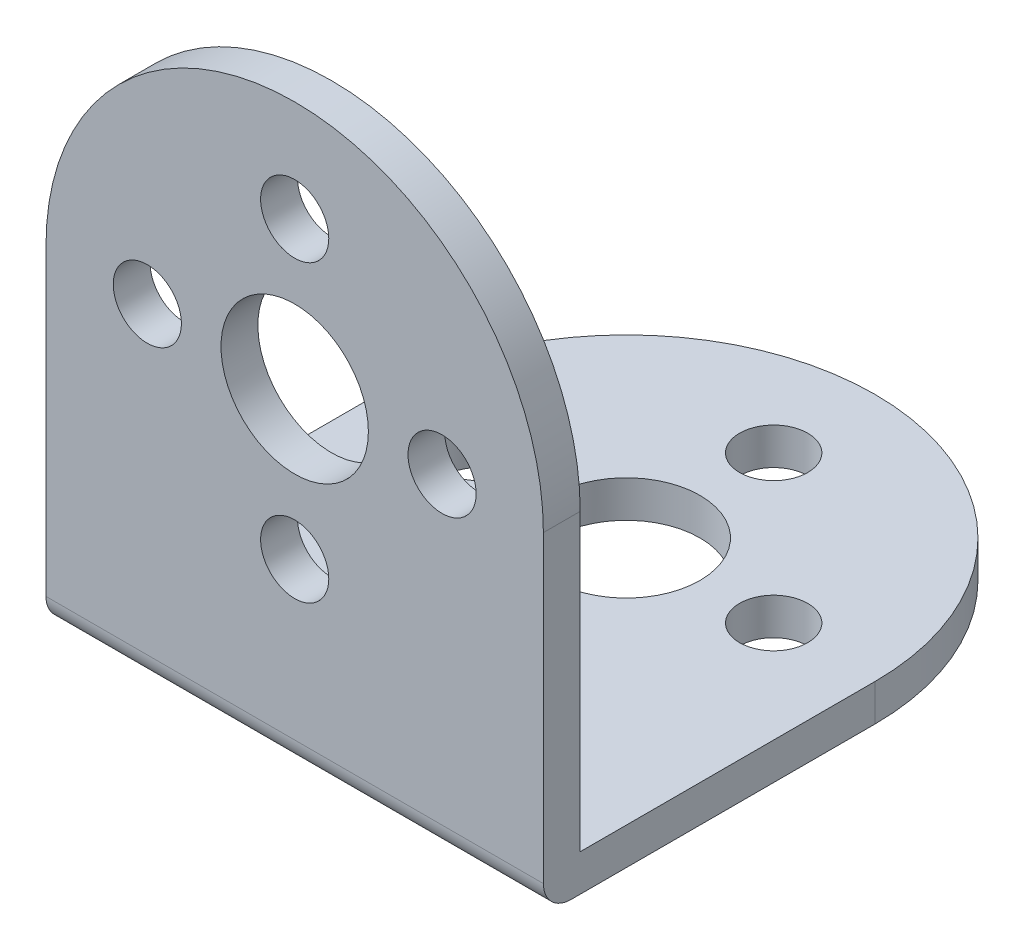
ISO-10303-21;
HEADER;
FILE_DESCRIPTION(('STEP AP214'),'2;1');
FILE_NAME('part.step','',(''),(''),'','','');
FILE_SCHEMA(('AUTOMOTIVE_DESIGN { 1 0 10303 214 1 1 1 1 }'));
ENDSEC;
DATA;
#1=APPLICATION_CONTEXT('core data for automotive mechanical design processes');
#2=APPLICATION_PROTOCOL_DEFINITION('international standard','automotive_design',2000,#1);
#3=PRODUCT_CONTEXT('',#1,'mechanical');
#4=PRODUCT('Part','Part','',(#3));
#5=PRODUCT_RELATED_PRODUCT_CATEGORY('part','',(#4));
#6=PRODUCT_DEFINITION_FORMATION('','',#4);
#7=PRODUCT_DEFINITION_CONTEXT('part definition',#1,'design');
#8=PRODUCT_DEFINITION('design','',#6,#7);
#9=PRODUCT_DEFINITION_SHAPE('','',#8);
#10=(LENGTH_UNIT() NAMED_UNIT(*) SI_UNIT(.MILLI.,.METRE.));
#11=(NAMED_UNIT(*) PLANE_ANGLE_UNIT() SI_UNIT($,.RADIAN.));
#12=(NAMED_UNIT(*) SI_UNIT($,.STERADIAN.) SOLID_ANGLE_UNIT());
#13=UNCERTAINTY_MEASURE_WITH_UNIT(LENGTH_MEASURE(1.E-05),#10,'distance_accuracy_value','');
#14=(GEOMETRIC_REPRESENTATION_CONTEXT(3) GLOBAL_UNCERTAINTY_ASSIGNED_CONTEXT((#13)) GLOBAL_UNIT_ASSIGNED_CONTEXT((#10,
#11,#12)) REPRESENTATION_CONTEXT('',''));
#15=CARTESIAN_POINT('',(0.,0.,0.));
#16=DIRECTION('',(0.,0.,1.));
#17=DIRECTION('',(1.,0.,0.));
#18=AXIS2_PLACEMENT_3D('',#15,#16,#17);
#19=CARTESIAN_POINT('',(0.,2.,-18.));
#20=DIRECTION('',(0.,1.,0.));
#21=DIRECTION('',(0.,0.,1.));
#22=AXIS2_PLACEMENT_3D('',#19,#20,#21);
#23=CYLINDRICAL_SURFACE('',#22,13.5);
#24=DIRECTION('',(0.,-1.,0.));
#25=VECTOR('',#24,1.);
#26=CARTESIAN_POINT('',(-13.5,2.,-18.));
#27=LINE('',#26,#25);
#28=CARTESIAN_POINT('',(-13.5,2.,-18.));
#29=VERTEX_POINT('',#28);
#30=CARTESIAN_POINT('',(-13.5,0.,-18.));
#31=VERTEX_POINT('',#30);
#32=EDGE_CURVE('E139',#29,#31,#27,.T.);
#33=ORIENTED_EDGE('',*,*,#32,.F.);
#34=CARTESIAN_POINT('',(0.,2.,-18.));
#35=DIRECTION('',(0.,1.,0.));
#36=DIRECTION('',(0.,0.,1.));
#37=AXIS2_PLACEMENT_3D('',#34,#35,#36);
#38=CIRCLE('',#37,13.5);
#39=CARTESIAN_POINT('',(13.5,2.,-18.));
#40=VERTEX_POINT('',#39);
#41=EDGE_CURVE('E100',#40,#29,#38,.T.);
#42=ORIENTED_EDGE('',*,*,#41,.F.);
#43=DIRECTION('',(0.,1.,0.));
#44=VECTOR('',#43,1.);
#45=CARTESIAN_POINT('',(13.5,0.,-18.));
#46=LINE('',#45,#44);
#47=CARTESIAN_POINT('',(13.5,0.,-18.));
#48=VERTEX_POINT('',#47);
#49=EDGE_CURVE('E141',#48,#40,#46,.T.);
#50=ORIENTED_EDGE('',*,*,#49,.F.);
#51=CARTESIAN_POINT('',(0.,0.,-18.));
#52=DIRECTION('',(0.,-1.,0.));
#53=DIRECTION('',(0.,0.,-1.));
#54=AXIS2_PLACEMENT_3D('',#51,#52,#53);
#55=CIRCLE('',#54,13.5);
#56=EDGE_CURVE('E145',#31,#48,#55,.T.);
#57=ORIENTED_EDGE('',*,*,#56,.F.);
#58=EDGE_LOOP('',(#33,#42,#50,#57));
#59=FACE_BOUND('',#58,.T.);
#60=ADVANCED_FACE('F37',(#59),#23,.T.);
#61=CARTESIAN_POINT('',(0.,18.,-2.));
#62=DIRECTION('',(0.,0.,1.));
#63=DIRECTION('',(1.,0.,0.));
#64=AXIS2_PLACEMENT_3D('',#61,#62,#63);
#65=CYLINDRICAL_SURFACE('',#64,13.5);
#66=DIRECTION('',(0.,0.,1.));
#67=VECTOR('',#66,1.);
#68=CARTESIAN_POINT('',(13.5,18.,0.));
#69=LINE('',#68,#67);
#70=CARTESIAN_POINT('',(13.5,18.,-2.));
#71=VERTEX_POINT('',#70);
#72=CARTESIAN_POINT('',(13.5,18.,0.));
#73=VERTEX_POINT('',#72);
#74=EDGE_CURVE('E113',#71,#73,#69,.T.);
#75=ORIENTED_EDGE('',*,*,#74,.F.);
#76=CARTESIAN_POINT('',(0.,18.,-2.));
#77=DIRECTION('',(0.,0.,-1.));
#78=DIRECTION('',(0.,1.,0.));
#79=AXIS2_PLACEMENT_3D('',#76,#77,#78);
#80=CIRCLE('',#79,13.5);
#81=CARTESIAN_POINT('',(-13.5,18.,-2.));
#82=VERTEX_POINT('',#81);
#83=EDGE_CURVE('E135',#82,#71,#80,.T.);
#84=ORIENTED_EDGE('',*,*,#83,.F.);
#85=DIRECTION('',(0.,0.,-1.));
#86=VECTOR('',#85,1.);
#87=CARTESIAN_POINT('',(-13.5,18.,-2.));
#88=LINE('',#87,#86);
#89=CARTESIAN_POINT('',(-13.5,18.,0.));
#90=VERTEX_POINT('',#89);
#91=EDGE_CURVE('E119',#90,#82,#88,.T.);
#92=ORIENTED_EDGE('',*,*,#91,.F.);
#93=CARTESIAN_POINT('',(0.,18.,0.));
#94=DIRECTION('',(0.,0.,1.));
#95=DIRECTION('',(0.,-1.,0.));
#96=AXIS2_PLACEMENT_3D('',#93,#94,#95);
#97=CIRCLE('',#96,13.5);
#98=EDGE_CURVE('E137',#73,#90,#97,.T.);
#99=ORIENTED_EDGE('',*,*,#98,.F.);
#100=EDGE_LOOP('',(#75,#84,#92,#99));
#101=FACE_BOUND('',#100,.T.);
#102=ADVANCED_FACE('F180',(#101),#65,.T.);
#103=CARTESIAN_POINT('',(-13.5,31.5,0.));
#104=DIRECTION('',(0.,0.,1.));
#105=DIRECTION('',(0.,-1.,0.));
#106=AXIS2_PLACEMENT_3D('',#103,#104,#105);
#107=PLANE('',#106);
#108=CARTESIAN_POINT('',(0.,26.,0.));
#109=DIRECTION('',(0.,0.,1.));
#110=DIRECTION('',(1.,0.,0.));
#111=AXIS2_PLACEMENT_3D('',#108,#109,#110);
#112=CIRCLE('',#111,1.85);
#113=CARTESIAN_POINT('',(1.85,26.,0.));
#114=VERTEX_POINT('',#113);
#115=EDGE_CURVE('E167',#114,#114,#112,.T.);
#116=ORIENTED_EDGE('',*,*,#115,.F.);
#117=EDGE_LOOP('',(#116));
#118=FACE_BOUND('',#117,.T.);
#119=CARTESIAN_POINT('',(0.,10.,0.));
#120=DIRECTION('',(0.,0.,1.));
#121=DIRECTION('',(1.,0.,0.));
#122=AXIS2_PLACEMENT_3D('',#119,#120,#121);
#123=CIRCLE('',#122,1.85);
#124=CARTESIAN_POINT('',(1.85,10.,0.));
#125=VERTEX_POINT('',#124);
#126=EDGE_CURVE('E163',#125,#125,#123,.T.);
#127=ORIENTED_EDGE('',*,*,#126,.F.);
#128=EDGE_LOOP('',(#127));
#129=FACE_BOUND('',#128,.T.);
#130=CARTESIAN_POINT('',(-8.,18.,0.));
#131=DIRECTION('',(0.,0.,1.));
#132=DIRECTION('',(1.,0.,0.));
#133=AXIS2_PLACEMENT_3D('',#130,#131,#132);
#134=CIRCLE('',#133,1.85);
#135=CARTESIAN_POINT('',(-6.15,18.,0.));
#136=VERTEX_POINT('',#135);
#137=EDGE_CURVE('E159',#136,#136,#134,.T.);
#138=ORIENTED_EDGE('',*,*,#137,.F.);
#139=EDGE_LOOP('',(#138));
#140=FACE_BOUND('',#139,.T.);
#141=CARTESIAN_POINT('',(8.,18.,0.));
#142=DIRECTION('',(0.,0.,1.));
#143=DIRECTION('',(1.,0.,0.));
#144=AXIS2_PLACEMENT_3D('',#141,#142,#143);
#145=CIRCLE('',#144,1.85);
#146=CARTESIAN_POINT('',(9.85,18.,0.));
#147=VERTEX_POINT('',#146);
#148=EDGE_CURVE('E155',#147,#147,#145,.T.);
#149=ORIENTED_EDGE('',*,*,#148,.F.);
#150=EDGE_LOOP('',(#149));
#151=FACE_BOUND('',#150,.T.);
#152=CARTESIAN_POINT('',(0.,18.,0.));
#153=DIRECTION('',(0.,0.,1.));
#154=DIRECTION('',(1.,0.,0.));
#155=AXIS2_PLACEMENT_3D('',#152,#153,#154);
#156=CIRCLE('',#155,4.);
#157=CARTESIAN_POINT('',(4.,18.,0.));
#158=VERTEX_POINT('',#157);
#159=EDGE_CURVE('E151',#158,#158,#156,.T.);
#160=ORIENTED_EDGE('',*,*,#159,.F.);
#161=EDGE_LOOP('',(#160));
#162=FACE_BOUND('',#161,.T.);
#163=DIRECTION('',(0.,-1.,0.));
#164=VECTOR('',#163,1.);
#165=CARTESIAN_POINT('',(-13.5,31.5,0.));
#166=LINE('',#165,#164);
#167=CARTESIAN_POINT('',(-13.5,1.5,0.));
#168=VERTEX_POINT('',#167);
#169=EDGE_CURVE('E130',#90,#168,#166,.T.);
#170=ORIENTED_EDGE('',*,*,#169,.T.);
#171=DIRECTION('',(1.,0.,0.));
#172=VECTOR('',#171,1.);
#173=CARTESIAN_POINT('',(-13.5,1.5,0.));
#174=LINE('',#173,#172);
#175=CARTESIAN_POINT('',(13.5,1.5,0.));
#176=VERTEX_POINT('',#175);
#177=EDGE_CURVE('E148',#168,#176,#174,.T.);
#178=ORIENTED_EDGE('',*,*,#177,.T.);
#179=DIRECTION('',(0.,-1.,0.));
#180=VECTOR('',#179,1.);
#181=CARTESIAN_POINT('',(13.5,31.5,0.));
#182=LINE('',#181,#180);
#183=EDGE_CURVE('E123',#73,#176,#182,.T.);
#184=ORIENTED_EDGE('',*,*,#183,.F.);
#185=ORIENTED_EDGE('',*,*,#98,.T.);
#186=EDGE_LOOP('',(#170,#178,#184,#185));
#187=FACE_BOUND('',#186,.T.);
#188=ADVANCED_FACE('F174',(#118,#129,#140,#151,#162,#187),#107,.T.);
#189=CARTESIAN_POINT('',(-13.5,2.,-2.));
#190=DIRECTION('',(0.,0.,-1.));
#191=DIRECTION('',(0.,1.,0.));
#192=AXIS2_PLACEMENT_3D('',#189,#190,#191);
#193=PLANE('',#192);
#194=CARTESIAN_POINT('',(0.,26.,-2.));
#195=DIRECTION('',(0.,0.,-1.));
#196=DIRECTION('',(0.,1.,0.));
#197=AXIS2_PLACEMENT_3D('',#194,#195,#196);
#198=CIRCLE('',#197,1.85);
#199=CARTESIAN_POINT('',(0.,27.85,-2.));
#200=VERTEX_POINT('',#199);
#201=EDGE_CURVE('E164',#200,#200,#198,.T.);
#202=ORIENTED_EDGE('',*,*,#201,.F.);
#203=EDGE_LOOP('',(#202));
#204=FACE_BOUND('',#203,.T.);
#205=CARTESIAN_POINT('',(0.,10.,-2.));
#206=DIRECTION('',(0.,0.,-1.));
#207=DIRECTION('',(0.,1.,0.));
#208=AXIS2_PLACEMENT_3D('',#205,#206,#207);
#209=CIRCLE('',#208,1.85);
#210=CARTESIAN_POINT('',(0.,11.85,-2.));
#211=VERTEX_POINT('',#210);
#212=EDGE_CURVE('E160',#211,#211,#209,.T.);
#213=ORIENTED_EDGE('',*,*,#212,.F.);
#214=EDGE_LOOP('',(#213));
#215=FACE_BOUND('',#214,.T.);
#216=CARTESIAN_POINT('',(-8.,18.,-2.));
#217=DIRECTION('',(0.,0.,-1.));
#218=DIRECTION('',(0.,1.,0.));
#219=AXIS2_PLACEMENT_3D('',#216,#217,#218);
#220=CIRCLE('',#219,1.85);
#221=CARTESIAN_POINT('',(-8.,19.85,-2.));
#222=VERTEX_POINT('',#221);
#223=EDGE_CURVE('E156',#222,#222,#220,.T.);
#224=ORIENTED_EDGE('',*,*,#223,.F.);
#225=EDGE_LOOP('',(#224));
#226=FACE_BOUND('',#225,.T.);
#227=CARTESIAN_POINT('',(8.,18.,-2.));
#228=DIRECTION('',(0.,0.,-1.));
#229=DIRECTION('',(0.,1.,0.));
#230=AXIS2_PLACEMENT_3D('',#227,#228,#229);
#231=CIRCLE('',#230,1.85);
#232=CARTESIAN_POINT('',(8.,19.85,-2.));
#233=VERTEX_POINT('',#232);
#234=EDGE_CURVE('E152',#233,#233,#231,.T.);
#235=ORIENTED_EDGE('',*,*,#234,.F.);
#236=EDGE_LOOP('',(#235));
#237=FACE_BOUND('',#236,.T.);
#238=CARTESIAN_POINT('',(0.,18.,-2.));
#239=DIRECTION('',(0.,0.,-1.));
#240=DIRECTION('',(0.,1.,0.));
#241=AXIS2_PLACEMENT_3D('',#238,#239,#240);
#242=CIRCLE('',#241,4.);
#243=CARTESIAN_POINT('',(0.,22.,-2.));
#244=VERTEX_POINT('',#243);
#245=EDGE_CURVE('E126',#244,#244,#242,.T.);
#246=ORIENTED_EDGE('',*,*,#245,.F.);
#247=EDGE_LOOP('',(#246));
#248=FACE_BOUND('',#247,.T.);
#249=DIRECTION('',(0.,1.,0.));
#250=VECTOR('',#249,1.);
#251=CARTESIAN_POINT('',(-13.5,2.,-2.));
#252=LINE('',#251,#250);
#253=CARTESIAN_POINT('',(-13.5,2.,-2.));
#254=VERTEX_POINT('',#253);
#255=EDGE_CURVE('E105',#254,#82,#252,.T.);
#256=ORIENTED_EDGE('',*,*,#255,.T.);
#257=ORIENTED_EDGE('',*,*,#83,.T.);
#258=DIRECTION('',(0.,1.,0.));
#259=VECTOR('',#258,1.);
#260=CARTESIAN_POINT('',(13.5,2.,-2.));
#261=LINE('',#260,#259);
#262=CARTESIAN_POINT('',(13.5,2.,-2.));
#263=VERTEX_POINT('',#262);
#264=EDGE_CURVE('E112',#263,#71,#261,.T.);
#265=ORIENTED_EDGE('',*,*,#264,.F.);
#266=DIRECTION('',(1.,0.,0.));
#267=VECTOR('',#266,1.);
#268=CARTESIAN_POINT('',(-13.5,2.,-2.));
#269=LINE('',#268,#267);
#270=EDGE_CURVE('E98',#254,#263,#269,.T.);
#271=ORIENTED_EDGE('',*,*,#270,.F.);
#272=EDGE_LOOP('',(#256,#257,#265,#271));
#273=FACE_BOUND('',#272,.T.);
#274=ADVANCED_FACE('F110',(#204,#215,#226,#237,#248,#273),#193,.T.);
#275=CARTESIAN_POINT('',(-13.5,2.,-31.5));
#276=DIRECTION('',(0.,1.,0.));
#277=DIRECTION('',(0.,0.,1.));
#278=AXIS2_PLACEMENT_3D('',#275,#276,#277);
#279=PLANE('',#278);
#280=CARTESIAN_POINT('',(0.,2.,-10.));
#281=DIRECTION('',(0.,1.,0.));
#282=DIRECTION('',(0.,0.,1.));
#283=AXIS2_PLACEMENT_3D('',#280,#281,#282);
#284=CIRCLE('',#283,1.85);
#285=CARTESIAN_POINT('',(0.,2.,-8.15));
#286=VERTEX_POINT('',#285);
#287=EDGE_CURVE('E217',#286,#286,#284,.T.);
#288=ORIENTED_EDGE('',*,*,#287,.F.);
#289=EDGE_LOOP('',(#288));
#290=FACE_BOUND('',#289,.T.);
#291=CARTESIAN_POINT('',(0.,2.,-26.));
#292=DIRECTION('',(0.,1.,0.));
#293=DIRECTION('',(0.,0.,1.));
#294=AXIS2_PLACEMENT_3D('',#291,#292,#293);
#295=CIRCLE('',#294,1.85);
#296=CARTESIAN_POINT('',(0.,2.,-24.15));
#297=VERTEX_POINT('',#296);
#298=EDGE_CURVE('E211',#297,#297,#295,.T.);
#299=ORIENTED_EDGE('',*,*,#298,.F.);
#300=EDGE_LOOP('',(#299));
#301=FACE_BOUND('',#300,.T.);
#302=CARTESIAN_POINT('',(-8.,2.,-18.));
#303=DIRECTION('',(0.,1.,0.));
#304=DIRECTION('',(0.,0.,1.));
#305=AXIS2_PLACEMENT_3D('',#302,#303,#304);
#306=CIRCLE('',#305,1.85);
#307=CARTESIAN_POINT('',(-8.,2.,-16.15));
#308=VERTEX_POINT('',#307);
#309=EDGE_CURVE('E205',#308,#308,#306,.T.);
#310=ORIENTED_EDGE('',*,*,#309,.F.);
#311=EDGE_LOOP('',(#310));
#312=FACE_BOUND('',#311,.T.);
#313=CARTESIAN_POINT('',(8.,2.,-18.));
#314=DIRECTION('',(0.,1.,0.));
#315=DIRECTION('',(0.,0.,1.));
#316=AXIS2_PLACEMENT_3D('',#313,#314,#315);
#317=CIRCLE('',#316,1.85);
#318=CARTESIAN_POINT('',(8.,2.,-16.15));
#319=VERTEX_POINT('',#318);
#320=EDGE_CURVE('E199',#319,#319,#317,.T.);
#321=ORIENTED_EDGE('',*,*,#320,.F.);
#322=EDGE_LOOP('',(#321));
#323=FACE_BOUND('',#322,.T.);
#324=CARTESIAN_POINT('',(0.,2.,-18.));
#325=DIRECTION('',(0.,1.,0.));
#326=DIRECTION('',(0.,0.,1.));
#327=AXIS2_PLACEMENT_3D('',#324,#325,#326);
#328=CIRCLE('',#327,4.);
#329=CARTESIAN_POINT('',(0.,2.,-14.));
#330=VERTEX_POINT('',#329);
#331=EDGE_CURVE('E193',#330,#330,#328,.T.);
#332=ORIENTED_EDGE('',*,*,#331,.F.);
#333=EDGE_LOOP('',(#332));
#334=FACE_BOUND('',#333,.T.);
#335=DIRECTION('',(0.,0.,1.));
#336=VECTOR('',#335,1.);
#337=CARTESIAN_POINT('',(13.5,2.,-31.5));
#338=LINE('',#337,#336);
#339=EDGE_CURVE('E128',#40,#263,#338,.T.);
#340=ORIENTED_EDGE('',*,*,#339,.F.);
#341=ORIENTED_EDGE('',*,*,#41,.T.);
#342=DIRECTION('',(0.,0.,1.));
#343=VECTOR('',#342,1.);
#344=CARTESIAN_POINT('',(-13.5,2.,-31.5));
#345=LINE('',#344,#343);
#346=EDGE_CURVE('E94',#29,#254,#345,.T.);
#347=ORIENTED_EDGE('',*,*,#346,.T.);
#348=ORIENTED_EDGE('',*,*,#270,.T.);
#349=EDGE_LOOP('',(#340,#341,#347,#348));
#350=FACE_BOUND('',#349,.T.);
#351=ADVANCED_FACE('F97',(#290,#301,#312,#323,#334,#350),#279,.T.);
#352=CARTESIAN_POINT('',(-13.5,0.,0.));
#353=DIRECTION('',(0.,-1.,0.));
#354=DIRECTION('',(0.,0.,-1.));
#355=AXIS2_PLACEMENT_3D('',#352,#353,#354);
#356=PLANE('',#355);
#357=CARTESIAN_POINT('',(0.,0.,-10.));
#358=DIRECTION('',(0.,-1.,0.));
#359=DIRECTION('',(0.,0.,-1.));
#360=AXIS2_PLACEMENT_3D('',#357,#358,#359);
#361=CIRCLE('',#360,1.85);
#362=CARTESIAN_POINT('',(0.,0.,-11.85));
#363=VERTEX_POINT('',#362);
#364=EDGE_CURVE('E220',#363,#363,#361,.T.);
#365=ORIENTED_EDGE('',*,*,#364,.F.);
#366=EDGE_LOOP('',(#365));
#367=FACE_BOUND('',#366,.T.);
#368=CARTESIAN_POINT('',(0.,0.,-26.));
#369=DIRECTION('',(0.,-1.,0.));
#370=DIRECTION('',(0.,0.,-1.));
#371=AXIS2_PLACEMENT_3D('',#368,#369,#370);
#372=CIRCLE('',#371,1.85);
#373=CARTESIAN_POINT('',(0.,0.,-27.85));
#374=VERTEX_POINT('',#373);
#375=EDGE_CURVE('E214',#374,#374,#372,.T.);
#376=ORIENTED_EDGE('',*,*,#375,.F.);
#377=EDGE_LOOP('',(#376));
#378=FACE_BOUND('',#377,.T.);
#379=CARTESIAN_POINT('',(-8.,0.,-18.));
#380=DIRECTION('',(0.,-1.,0.));
#381=DIRECTION('',(0.,0.,-1.));
#382=AXIS2_PLACEMENT_3D('',#379,#380,#381);
#383=CIRCLE('',#382,1.85);
#384=CARTESIAN_POINT('',(-8.,0.,-19.85));
#385=VERTEX_POINT('',#384);
#386=EDGE_CURVE('E208',#385,#385,#383,.T.);
#387=ORIENTED_EDGE('',*,*,#386,.F.);
#388=EDGE_LOOP('',(#387));
#389=FACE_BOUND('',#388,.T.);
#390=CARTESIAN_POINT('',(8.,0.,-18.));
#391=DIRECTION('',(0.,-1.,0.));
#392=DIRECTION('',(0.,0.,-1.));
#393=AXIS2_PLACEMENT_3D('',#390,#391,#392);
#394=CIRCLE('',#393,1.85);
#395=CARTESIAN_POINT('',(8.,0.,-19.85));
#396=VERTEX_POINT('',#395);
#397=EDGE_CURVE('E202',#396,#396,#394,.T.);
#398=ORIENTED_EDGE('',*,*,#397,.F.);
#399=EDGE_LOOP('',(#398));
#400=FACE_BOUND('',#399,.T.);
#401=CARTESIAN_POINT('',(0.,0.,-18.));
#402=DIRECTION('',(0.,-1.,0.));
#403=DIRECTION('',(0.,0.,-1.));
#404=AXIS2_PLACEMENT_3D('',#401,#402,#403);
#405=CIRCLE('',#404,4.);
#406=CARTESIAN_POINT('',(0.,0.,-22.));
#407=VERTEX_POINT('',#406);
#408=EDGE_CURVE('E196',#407,#407,#405,.T.);
#409=ORIENTED_EDGE('',*,*,#408,.F.);
#410=EDGE_LOOP('',(#409));
#411=FACE_BOUND('',#410,.T.);
#412=DIRECTION('',(0.,0.,-1.));
#413=VECTOR('',#412,1.);
#414=CARTESIAN_POINT('',(13.5,0.,0.));
#415=LINE('',#414,#413);
#416=CARTESIAN_POINT('',(13.5,0.,-1.5));
#417=VERTEX_POINT('',#416);
#418=EDGE_CURVE('E125',#417,#48,#415,.T.);
#419=ORIENTED_EDGE('',*,*,#418,.F.);
#420=DIRECTION('',(1.,0.,0.));
#421=VECTOR('',#420,1.);
#422=CARTESIAN_POINT('',(-13.5,0.,-1.5));
#423=LINE('',#422,#421);
#424=CARTESIAN_POINT('',(-13.5,0.,-1.5));
#425=VERTEX_POINT('',#424);
#426=EDGE_CURVE('E45',#417,#425,#423,.F.);
#427=ORIENTED_EDGE('',*,*,#426,.T.);
#428=DIRECTION('',(0.,0.,-1.));
#429=VECTOR('',#428,1.);
#430=CARTESIAN_POINT('',(-13.5,0.,0.));
#431=LINE('',#430,#429);
#432=EDGE_CURVE('E106',#425,#31,#431,.T.);
#433=ORIENTED_EDGE('',*,*,#432,.T.);
#434=ORIENTED_EDGE('',*,*,#56,.T.);
#435=EDGE_LOOP('',(#419,#427,#433,#434));
#436=FACE_BOUND('',#435,.T.);
#437=ADVANCED_FACE('F226',(#367,#378,#389,#400,#411,#436),#356,.T.);
#438=CARTESIAN_POINT('',(-13.5,0.,0.));
#439=DIRECTION('',(1.,0.,0.));
#440=DIRECTION('',(0.,0.,-1.));
#441=AXIS2_PLACEMENT_3D('',#438,#439,#440);
#442=PLANE('',#441);
#443=ORIENTED_EDGE('',*,*,#432,.F.);
#444=CARTESIAN_POINT('',(-13.5,1.5,-1.5));
#445=DIRECTION('',(1.,0.,0.));
#446=DIRECTION('',(0.,0.,-1.));
#447=AXIS2_PLACEMENT_3D('',#444,#445,#446);
#448=CIRCLE('',#447,1.5);
#449=EDGE_CURVE('E11',#425,#168,#448,.F.);
#450=ORIENTED_EDGE('',*,*,#449,.T.);
#451=ORIENTED_EDGE('',*,*,#169,.F.);
#452=ORIENTED_EDGE('',*,*,#91,.T.);
#453=ORIENTED_EDGE('',*,*,#255,.F.);
#454=ORIENTED_EDGE('',*,*,#346,.F.);
#455=ORIENTED_EDGE('',*,*,#32,.T.);
#456=EDGE_LOOP('',(#443,#450,#451,#452,#453,#454,#455));
#457=FACE_BOUND('',#456,.T.);
#458=ADVANCED_FACE('F116',(#457),#442,.F.);
#459=CARTESIAN_POINT('',(13.5,0.,0.));
#460=DIRECTION('',(1.,0.,0.));
#461=DIRECTION('',(0.,0.,-1.));
#462=AXIS2_PLACEMENT_3D('',#459,#460,#461);
#463=PLANE('',#462);
#464=ORIENTED_EDGE('',*,*,#183,.T.);
#465=CARTESIAN_POINT('',(13.5,1.5,-1.5));
#466=DIRECTION('',(1.,0.,0.));
#467=DIRECTION('',(0.,0.,-1.));
#468=AXIS2_PLACEMENT_3D('',#465,#466,#467);
#469=CIRCLE('',#468,1.5);
#470=EDGE_CURVE('E59',#176,#417,#469,.T.);
#471=ORIENTED_EDGE('',*,*,#470,.T.);
#472=ORIENTED_EDGE('',*,*,#418,.T.);
#473=ORIENTED_EDGE('',*,*,#49,.T.);
#474=ORIENTED_EDGE('',*,*,#339,.T.);
#475=ORIENTED_EDGE('',*,*,#264,.T.);
#476=ORIENTED_EDGE('',*,*,#74,.T.);
#477=EDGE_LOOP('',(#464,#471,#472,#473,#474,#475,#476));
#478=FACE_BOUND('',#477,.T.);
#479=ADVANCED_FACE('F177',(#478),#463,.T.);
#480=CARTESIAN_POINT('',(0.,18.,-31.5));
#481=DIRECTION('',(0.,0.,1.));
#482=DIRECTION('',(1.,0.,0.));
#483=AXIS2_PLACEMENT_3D('',#480,#481,#482);
#484=CYLINDRICAL_SURFACE('',#483,4.);
#485=ORIENTED_EDGE('',*,*,#245,.T.);
#486=EDGE_LOOP('',(#485));
#487=FACE_BOUND('',#486,.T.);
#488=ORIENTED_EDGE('',*,*,#159,.T.);
#489=EDGE_LOOP('',(#488));
#490=FACE_BOUND('',#489,.T.);
#491=ADVANCED_FACE('F264',(#487,#490),#484,.F.);
#492=CARTESIAN_POINT('',(8.,18.,-31.5));
#493=DIRECTION('',(0.,0.,1.));
#494=DIRECTION('',(1.,0.,0.));
#495=AXIS2_PLACEMENT_3D('',#492,#493,#494);
#496=CYLINDRICAL_SURFACE('',#495,1.85);
#497=ORIENTED_EDGE('',*,*,#234,.T.);
#498=EDGE_LOOP('',(#497));
#499=FACE_BOUND('',#498,.T.);
#500=ORIENTED_EDGE('',*,*,#148,.T.);
#501=EDGE_LOOP('',(#500));
#502=FACE_BOUND('',#501,.T.);
#503=ADVANCED_FACE('F269',(#499,#502),#496,.F.);
#504=CARTESIAN_POINT('',(-8.,18.,-31.5));
#505=DIRECTION('',(0.,0.,1.));
#506=DIRECTION('',(1.,0.,0.));
#507=AXIS2_PLACEMENT_3D('',#504,#505,#506);
#508=CYLINDRICAL_SURFACE('',#507,1.85);
#509=ORIENTED_EDGE('',*,*,#223,.T.);
#510=EDGE_LOOP('',(#509));
#511=FACE_BOUND('',#510,.T.);
#512=ORIENTED_EDGE('',*,*,#137,.T.);
#513=EDGE_LOOP('',(#512));
#514=FACE_BOUND('',#513,.T.);
#515=ADVANCED_FACE('F273',(#511,#514),#508,.F.);
#516=CARTESIAN_POINT('',(0.,10.,-31.5));
#517=DIRECTION('',(0.,0.,1.));
#518=DIRECTION('',(1.,0.,0.));
#519=AXIS2_PLACEMENT_3D('',#516,#517,#518);
#520=CYLINDRICAL_SURFACE('',#519,1.85);
#521=ORIENTED_EDGE('',*,*,#212,.T.);
#522=EDGE_LOOP('',(#521));
#523=FACE_BOUND('',#522,.T.);
#524=ORIENTED_EDGE('',*,*,#126,.T.);
#525=EDGE_LOOP('',(#524));
#526=FACE_BOUND('',#525,.T.);
#527=ADVANCED_FACE('F277',(#523,#526),#520,.F.);
#528=CARTESIAN_POINT('',(0.,26.,-31.5));
#529=DIRECTION('',(0.,0.,1.));
#530=DIRECTION('',(1.,0.,0.));
#531=AXIS2_PLACEMENT_3D('',#528,#529,#530);
#532=CYLINDRICAL_SURFACE('',#531,1.85);
#533=ORIENTED_EDGE('',*,*,#201,.T.);
#534=EDGE_LOOP('',(#533));
#535=FACE_BOUND('',#534,.T.);
#536=ORIENTED_EDGE('',*,*,#115,.T.);
#537=EDGE_LOOP('',(#536));
#538=FACE_BOUND('',#537,.T.);
#539=ADVANCED_FACE('F281',(#535,#538),#532,.F.);
#540=CARTESIAN_POINT('',(0.,31.5,-18.));
#541=DIRECTION('',(0.,-1.,0.));
#542=DIRECTION('',(0.,0.,-1.));
#543=AXIS2_PLACEMENT_3D('',#540,#541,#542);
#544=CYLINDRICAL_SURFACE('',#543,4.);
#545=ORIENTED_EDGE('',*,*,#331,.T.);
#546=EDGE_LOOP('',(#545));
#547=FACE_BOUND('',#546,.T.);
#548=ORIENTED_EDGE('',*,*,#408,.T.);
#549=EDGE_LOOP('',(#548));
#550=FACE_BOUND('',#549,.T.);
#551=ADVANCED_FACE('F285',(#547,#550),#544,.F.);
#552=CARTESIAN_POINT('',(8.,31.5,-18.));
#553=DIRECTION('',(0.,-1.,0.));
#554=DIRECTION('',(0.,0.,-1.));
#555=AXIS2_PLACEMENT_3D('',#552,#553,#554);
#556=CYLINDRICAL_SURFACE('',#555,1.85);
#557=ORIENTED_EDGE('',*,*,#320,.T.);
#558=EDGE_LOOP('',(#557));
#559=FACE_BOUND('',#558,.T.);
#560=ORIENTED_EDGE('',*,*,#397,.T.);
#561=EDGE_LOOP('',(#560));
#562=FACE_BOUND('',#561,.T.);
#563=ADVANCED_FACE('F289',(#559,#562),#556,.F.);
#564=CARTESIAN_POINT('',(-8.,31.5,-18.));
#565=DIRECTION('',(0.,-1.,0.));
#566=DIRECTION('',(0.,0.,-1.));
#567=AXIS2_PLACEMENT_3D('',#564,#565,#566);
#568=CYLINDRICAL_SURFACE('',#567,1.85);
#569=ORIENTED_EDGE('',*,*,#309,.T.);
#570=EDGE_LOOP('',(#569));
#571=FACE_BOUND('',#570,.T.);
#572=ORIENTED_EDGE('',*,*,#386,.T.);
#573=EDGE_LOOP('',(#572));
#574=FACE_BOUND('',#573,.T.);
#575=ADVANCED_FACE('F293',(#571,#574),#568,.F.);
#576=CARTESIAN_POINT('',(0.,31.5,-26.));
#577=DIRECTION('',(0.,-1.,0.));
#578=DIRECTION('',(0.,0.,-1.));
#579=AXIS2_PLACEMENT_3D('',#576,#577,#578);
#580=CYLINDRICAL_SURFACE('',#579,1.85);
#581=ORIENTED_EDGE('',*,*,#298,.T.);
#582=EDGE_LOOP('',(#581));
#583=FACE_BOUND('',#582,.T.);
#584=ORIENTED_EDGE('',*,*,#375,.T.);
#585=EDGE_LOOP('',(#584));
#586=FACE_BOUND('',#585,.T.);
#587=ADVANCED_FACE('F243',(#583,#586),#580,.F.);
#588=CARTESIAN_POINT('',(0.,31.5,-10.));
#589=DIRECTION('',(0.,-1.,0.));
#590=DIRECTION('',(0.,0.,-1.));
#591=AXIS2_PLACEMENT_3D('',#588,#589,#590);
#592=CYLINDRICAL_SURFACE('',#591,1.85);
#593=ORIENTED_EDGE('',*,*,#287,.T.);
#594=EDGE_LOOP('',(#593));
#595=FACE_BOUND('',#594,.T.);
#596=ORIENTED_EDGE('',*,*,#364,.T.);
#597=EDGE_LOOP('',(#596));
#598=FACE_BOUND('',#597,.T.);
#599=ADVANCED_FACE('F224',(#595,#598),#592,.F.);
#600=CARTESIAN_POINT('',(-13.5,1.5,-1.5));
#601=DIRECTION('',(1.,0.,0.));
#602=DIRECTION('',(0.,0.,-1.));
#603=AXIS2_PLACEMENT_3D('',#600,#601,#602);
#604=CYLINDRICAL_SURFACE('',#603,1.5);
#605=ORIENTED_EDGE('',*,*,#449,.F.);
#606=ORIENTED_EDGE('',*,*,#426,.F.);
#607=ORIENTED_EDGE('',*,*,#470,.F.);
#608=ORIENTED_EDGE('',*,*,#177,.F.);
#609=EDGE_LOOP('',(#605,#606,#607,#608));
#610=FACE_BOUND('',#609,.T.);
#611=ADVANCED_FACE('F39',(#610),#604,.T.);
#612=CLOSED_SHELL('',(#60,#102,#188,#274,#351,#437,#458,#479,#491,#503,#515,#527,#539,#551,#563,
#575,#587,#599,#611));
#613=MANIFOLD_SOLID_BREP('B2',#612);
#614=ADVANCED_BREP_SHAPE_REPRESENTATION('',(#18,#613),#14);
#615=SHAPE_DEFINITION_REPRESENTATION(#9,#614);
ENDSEC;
END-ISO-10303-21;
